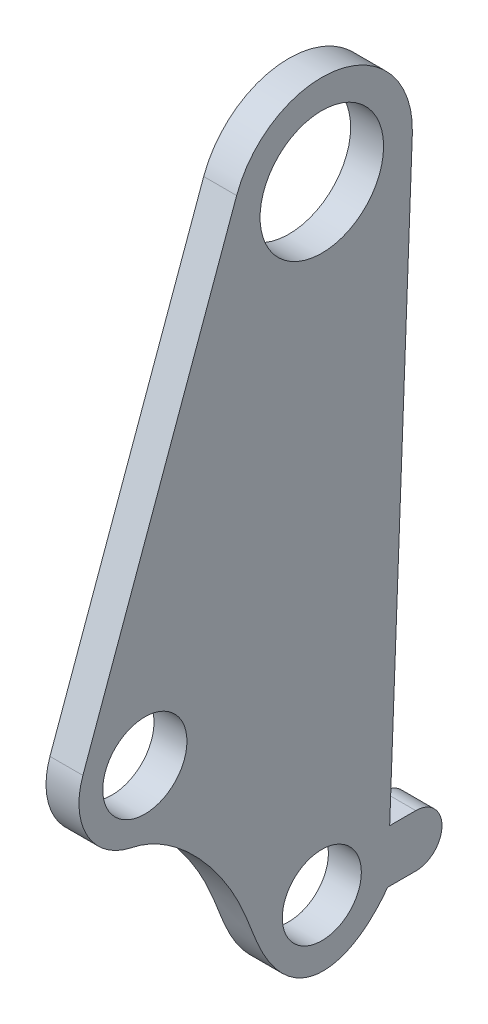
ISO-10303-21;
HEADER;
FILE_DESCRIPTION(('STEP AP214'),'2;1');
FILE_NAME('part.step','',(''),(''),'','','');
FILE_SCHEMA(('AUTOMOTIVE_DESIGN { 1 0 10303 214 1 1 1 1 }'));
ENDSEC;
DATA;
#1=APPLICATION_CONTEXT('core data for automotive mechanical design processes');
#2=APPLICATION_PROTOCOL_DEFINITION('international standard','automotive_design',2000,#1);
#3=PRODUCT_CONTEXT('',#1,'mechanical');
#4=PRODUCT('Part','Part','',(#3));
#5=PRODUCT_RELATED_PRODUCT_CATEGORY('part','',(#4));
#6=PRODUCT_DEFINITION_FORMATION('','',#4);
#7=PRODUCT_DEFINITION_CONTEXT('part definition',#1,'design');
#8=PRODUCT_DEFINITION('design','',#6,#7);
#9=PRODUCT_DEFINITION_SHAPE('','',#8);
#10=(LENGTH_UNIT() NAMED_UNIT(*) SI_UNIT(.MILLI.,.METRE.));
#11=(NAMED_UNIT(*) PLANE_ANGLE_UNIT() SI_UNIT($,.RADIAN.));
#12=(NAMED_UNIT(*) SI_UNIT($,.STERADIAN.) SOLID_ANGLE_UNIT());
#13=UNCERTAINTY_MEASURE_WITH_UNIT(LENGTH_MEASURE(1.E-05),#10,'distance_accuracy_value','');
#14=(GEOMETRIC_REPRESENTATION_CONTEXT(3) GLOBAL_UNCERTAINTY_ASSIGNED_CONTEXT((#13)) GLOBAL_UNIT_ASSIGNED_CONTEXT((#10,
#11,#12)) REPRESENTATION_CONTEXT('',''));
#15=CARTESIAN_POINT('',(0.,0.,0.));
#16=DIRECTION('',(0.,0.,1.));
#17=DIRECTION('',(1.,0.,0.));
#18=AXIS2_PLACEMENT_3D('',#15,#16,#17);
#19=CARTESIAN_POINT('',(2.54,0.,0.));
#20=DIRECTION('',(-1.,0.,0.));
#21=DIRECTION('',(0.,0.,1.));
#22=AXIS2_PLACEMENT_3D('',#19,#20,#21);
#23=PLANE('',#22);
#24=CARTESIAN_POINT('',(2.54,-32.1486320068265,13.6462846624879));
#25=DIRECTION('',(1.,0.,0.));
#26=DIRECTION('',(0.,0.,-1.));
#27=AXIS2_PLACEMENT_3D('',#24,#25,#26);
#28=CIRCLE('',#27,3.24612);
#29=CARTESIAN_POINT('',(2.54,-32.1486320068265,10.4001646624879));
#30=VERTEX_POINT('',#29);
#31=EDGE_CURVE('E314',#30,#30,#28,.T.);
#32=ORIENTED_EDGE('',*,*,#31,.F.);
#33=EDGE_LOOP('',(#32));
#34=FACE_BOUND('',#33,.T.);
#35=CARTESIAN_POINT('',(2.54,0.,0.));
#36=DIRECTION('',(1.,0.,0.));
#37=DIRECTION('',(0.,0.,1.));
#38=AXIS2_PLACEMENT_3D('',#35,#36,#37);
#39=CIRCLE('',#38,6.985);
#40=CARTESIAN_POINT('',(2.54,-0.269096125838359,-6.97981463042242));
#41=VERTEX_POINT('',#40);
#42=CARTESIAN_POINT('',(2.54,2.37448150732322,6.56902295409143));
#43=VERTEX_POINT('',#42);
#44=EDGE_CURVE('E150',#41,#43,#39,.T.);
#45=ORIENTED_EDGE('',*,*,#44,.T.);
#46=DIRECTION('',(0.,-0.940447094358114,0.339940086946775));
#47=VECTOR('',#46,1.);
#48=CARTESIAN_POINT('',(2.54,2.37448150732322,6.56902295409143));
#49=LINE('',#48,#47);
#50=CARTESIAN_POINT('',(2.54,-30.4217363651368,18.4237559018271));
#51=VERTEX_POINT('',#50);
#52=EDGE_CURVE('E93',#43,#51,#49,.T.);
#53=ORIENTED_EDGE('',*,*,#52,.T.);
#54=CARTESIAN_POINT('',(2.54,-32.1486320068265,13.6462846624879));
#55=DIRECTION('',(1.,0.,0.));
#56=DIRECTION('',(0.,0.,1.));
#57=AXIS2_PLACEMENT_3D('',#54,#55,#56);
#58=CIRCLE('',#57,5.08);
#59=CARTESIAN_POINT('',(2.54,-37.1244870220178,14.669645238138));
#60=VERTEX_POINT('',#59);
#61=EDGE_CURVE('E165',#51,#60,#58,.T.);
#62=ORIENTED_EDGE('',*,*,#61,.T.);
#63=CARTESIAN_POINT('',(2.54,-37.1244870220178,14.669645238138));
#64=CARTESIAN_POINT('',(2.54,-37.8142676215172,11.3157459996212));
#65=CARTESIAN_POINT('',(2.54,-42.7155459658299,6.92087440231046));
#66=CARTESIAN_POINT('',(2.54,-54.1753966063674,3.14946829544974));
#67=CARTESIAN_POINT('',(2.54,-53.8016461812624,-2.01655162994688));
#68=CARTESIAN_POINT('',(2.54,-49.6443,-5.0762288221254));
#69=B_SPLINE_CURVE_WITH_KNOTS('',3,(#63,#64,#65,#66,#67,#68),.UNSPECIFIED.,.F.,.F.,(4,1,1,4),
(0.,0.321172828786322,0.421172828786322,1.),.UNSPECIFIED.);
#70=CARTESIAN_POINT('',(2.54,-49.6443,-5.0762288221254));
#71=VERTEX_POINT('',#70);
#72=EDGE_CURVE('E178',#60,#71,#69,.T.);
#73=ORIENTED_EDGE('',*,*,#72,.T.);
#74=DIRECTION('',(0.,0.,-1.));
#75=VECTOR('',#74,1.);
#76=CARTESIAN_POINT('',(2.54,-49.6443,-5.07622882212539));
#77=LINE('',#76,#75);
#78=CARTESIAN_POINT('',(2.54,-49.6443,-7.24445656026835));
#79=VERTEX_POINT('',#78);
#80=EDGE_CURVE('E112',#71,#79,#77,.T.);
#81=ORIENTED_EDGE('',*,*,#80,.T.);
#82=CARTESIAN_POINT('',(2.54,-47.625,-7.24445656026835));
#83=DIRECTION('',(1.,0.,0.));
#84=DIRECTION('',(0.,0.,1.));
#85=AXIS2_PLACEMENT_3D('',#82,#83,#84);
#86=CIRCLE('',#85,2.0193);
#87=CARTESIAN_POINT('',(2.54,-45.6057,-7.24445656026835));
#88=VERTEX_POINT('',#87);
#89=EDGE_CURVE('E106',#79,#88,#86,.T.);
#90=ORIENTED_EDGE('',*,*,#89,.T.);
#91=DIRECTION('',(0.,0.,1.));
#92=VECTOR('',#91,1.);
#93=CARTESIAN_POINT('',(2.54,-45.6057,-5.23193089608506));
#94=LINE('',#93,#92);
#95=CARTESIAN_POINT('',(2.54,-45.6057,-5.23193089608506));
#96=VERTEX_POINT('',#95);
#97=EDGE_CURVE('E110',#88,#96,#94,.T.);
#98=ORIENTED_EDGE('',*,*,#97,.T.);
#99=DIRECTION('',(0.,0.999257642150668,-0.0385248569561001));
#100=VECTOR('',#99,1.);
#101=CARTESIAN_POINT('',(2.54,-0.269096125838359,-6.97981463042242));
#102=LINE('',#101,#100);
#103=EDGE_CURVE('E50',#96,#41,#102,.T.);
#104=ORIENTED_EDGE('',*,*,#103,.T.);
#105=EDGE_LOOP('',(#45,#53,#62,#73,#81,#90,#98,#104));
#106=FACE_BOUND('',#105,.T.);
#107=CARTESIAN_POINT('',(2.54,0.,0.));
#108=DIRECTION('',(1.,0.,0.));
#109=DIRECTION('',(0.,0.,-1.));
#110=AXIS2_PLACEMENT_3D('',#107,#108,#109);
#111=CIRCLE('',#110,4.7625);
#112=CARTESIAN_POINT('',(2.54,0.,-4.7625));
#113=VERTEX_POINT('',#112);
#114=EDGE_CURVE('E134',#113,#113,#111,.T.);
#115=ORIENTED_EDGE('',*,*,#114,.F.);
#116=EDGE_LOOP('',(#115));
#117=FACE_BOUND('',#116,.T.);
#118=CARTESIAN_POINT('',(2.54,-47.625,0.));
#119=DIRECTION('',(1.,0.,0.));
#120=DIRECTION('',(0.,0.,-1.));
#121=AXIS2_PLACEMENT_3D('',#118,#119,#120);
#122=CIRCLE('',#121,3.048);
#123=CARTESIAN_POINT('',(2.54,-47.625,-3.04800000000001));
#124=VERTEX_POINT('',#123);
#125=EDGE_CURVE('E305',#124,#124,#122,.T.);
#126=ORIENTED_EDGE('',*,*,#125,.F.);
#127=EDGE_LOOP('',(#126));
#128=FACE_BOUND('',#127,.T.);
#129=ADVANCED_FACE('F33',(#34,#106,#117,#128),#23,.F.);
#130=CARTESIAN_POINT('',(0.,0.,0.));
#131=DIRECTION('',(-1.,0.,0.));
#132=DIRECTION('',(0.,0.,1.));
#133=AXIS2_PLACEMENT_3D('',#130,#131,#132);
#134=PLANE('',#133);
#135=CARTESIAN_POINT('',(0.,-32.1486320068265,13.6462846624879));
#136=DIRECTION('',(1.,0.,0.));
#137=DIRECTION('',(0.,0.,-1.));
#138=AXIS2_PLACEMENT_3D('',#135,#136,#137);
#139=CIRCLE('',#138,3.24612);
#140=CARTESIAN_POINT('',(0.,-32.1486320068265,10.4001646624879));
#141=VERTEX_POINT('',#140);
#142=EDGE_CURVE('E311',#141,#141,#139,.T.);
#143=ORIENTED_EDGE('',*,*,#142,.T.);
#144=EDGE_LOOP('',(#143));
#145=FACE_BOUND('',#144,.T.);
#146=CARTESIAN_POINT('',(0.,0.,0.));
#147=DIRECTION('',(1.,0.,0.));
#148=DIRECTION('',(0.,0.,1.));
#149=AXIS2_PLACEMENT_3D('',#146,#147,#148);
#150=CIRCLE('',#149,6.985);
#151=CARTESIAN_POINT('',(0.,-0.269096125838359,-6.97981463042242));
#152=VERTEX_POINT('',#151);
#153=CARTESIAN_POINT('',(0.,2.37448150732322,6.56902295409143));
#154=VERTEX_POINT('',#153);
#155=EDGE_CURVE('E130',#152,#154,#150,.T.);
#156=ORIENTED_EDGE('',*,*,#155,.F.);
#157=DIRECTION('',(0.,0.999257642150668,-0.0385248569561001));
#158=VECTOR('',#157,1.);
#159=CARTESIAN_POINT('',(0.,-0.269096125838359,-6.97981463042242));
#160=LINE('',#159,#158);
#161=CARTESIAN_POINT('',(0.,-45.6057,-5.23193089608506));
#162=VERTEX_POINT('',#161);
#163=EDGE_CURVE('E85',#162,#152,#160,.T.);
#164=ORIENTED_EDGE('',*,*,#163,.F.);
#165=DIRECTION('',(0.,0.,1.));
#166=VECTOR('',#165,1.);
#167=CARTESIAN_POINT('',(0.,-45.6057,-5.23193089608506));
#168=LINE('',#167,#166);
#169=CARTESIAN_POINT('',(0.,-45.6057,-7.24445656026835));
#170=VERTEX_POINT('',#169);
#171=EDGE_CURVE('E79',#170,#162,#168,.T.);
#172=ORIENTED_EDGE('',*,*,#171,.F.);
#173=CARTESIAN_POINT('',(0.,-47.625,-7.24445656026835));
#174=DIRECTION('',(1.,0.,0.));
#175=DIRECTION('',(0.,0.,1.));
#176=AXIS2_PLACEMENT_3D('',#173,#174,#175);
#177=CIRCLE('',#176,2.0193);
#178=CARTESIAN_POINT('',(0.,-49.6443,-7.24445656026835));
#179=VERTEX_POINT('',#178);
#180=EDGE_CURVE('E120',#179,#170,#177,.T.);
#181=ORIENTED_EDGE('',*,*,#180,.F.);
#182=DIRECTION('',(0.,0.,-1.));
#183=VECTOR('',#182,1.);
#184=CARTESIAN_POINT('',(0.,-49.6443,-5.07622882212539));
#185=LINE('',#184,#183);
#186=CARTESIAN_POINT('',(0.,-49.6443,-5.0762288221254));
#187=VERTEX_POINT('',#186);
#188=EDGE_CURVE('E142',#187,#179,#185,.T.);
#189=ORIENTED_EDGE('',*,*,#188,.F.);
#190=CARTESIAN_POINT('',(0.,-37.1244870220178,14.669645238138));
#191=CARTESIAN_POINT('',(0.,-37.8142676215172,11.3157459996212));
#192=CARTESIAN_POINT('',(0.,-42.7155459658299,6.92087440231046));
#193=CARTESIAN_POINT('',(0.,-54.1753966063674,3.14946829544974));
#194=CARTESIAN_POINT('',(0.,-53.8016461812624,-2.01655162994688));
#195=CARTESIAN_POINT('',(0.,-49.6443,-5.0762288221254));
#196=B_SPLINE_CURVE_WITH_KNOTS('',3,(#190,#191,#192,#193,#194,#195),.UNSPECIFIED.,.F.,.F.,(4,1,
1,4),(0.,0.321172828786322,0.421172828786322,1.),.UNSPECIFIED.);
#197=CARTESIAN_POINT('',(0.,-37.1244870220178,14.669645238138));
#198=VERTEX_POINT('',#197);
#199=EDGE_CURVE('E138',#198,#187,#196,.T.);
#200=ORIENTED_EDGE('',*,*,#199,.F.);
#201=CARTESIAN_POINT('',(0.,-32.1486320068265,13.6462846624879));
#202=DIRECTION('',(1.,0.,0.));
#203=DIRECTION('',(0.,0.,1.));
#204=AXIS2_PLACEMENT_3D('',#201,#202,#203);
#205=CIRCLE('',#204,5.08);
#206=CARTESIAN_POINT('',(0.,-30.4217363651368,18.4237559018271));
#207=VERTEX_POINT('',#206);
#208=EDGE_CURVE('E136',#207,#198,#205,.T.);
#209=ORIENTED_EDGE('',*,*,#208,.F.);
#210=DIRECTION('',(0.,-0.940447094358114,0.339940086946775));
#211=VECTOR('',#210,1.);
#212=CARTESIAN_POINT('',(0.,2.37448150732322,6.56902295409143));
#213=LINE('',#212,#211);
#214=EDGE_CURVE('E133',#154,#207,#213,.T.);
#215=ORIENTED_EDGE('',*,*,#214,.F.);
#216=EDGE_LOOP('',(#156,#164,#172,#181,#189,#200,#209,#215));
#217=FACE_BOUND('',#216,.T.);
#218=CARTESIAN_POINT('',(0.,0.,0.));
#219=DIRECTION('',(1.,0.,0.));
#220=DIRECTION('',(0.,0.,-1.));
#221=AXIS2_PLACEMENT_3D('',#218,#219,#220);
#222=CIRCLE('',#221,4.7625);
#223=CARTESIAN_POINT('',(0.,0.,-4.7625));
#224=VERTEX_POINT('',#223);
#225=EDGE_CURVE('E317',#224,#224,#222,.T.);
#226=ORIENTED_EDGE('',*,*,#225,.T.);
#227=EDGE_LOOP('',(#226));
#228=FACE_BOUND('',#227,.T.);
#229=CARTESIAN_POINT('',(0.,-47.625,0.));
#230=DIRECTION('',(1.,0.,0.));
#231=DIRECTION('',(0.,0.,-1.));
#232=AXIS2_PLACEMENT_3D('',#229,#230,#231);
#233=CIRCLE('',#232,3.048);
#234=CARTESIAN_POINT('',(0.,-47.625,-3.04800000000001));
#235=VERTEX_POINT('',#234);
#236=EDGE_CURVE('E308',#235,#235,#233,.T.);
#237=ORIENTED_EDGE('',*,*,#236,.T.);
#238=EDGE_LOOP('',(#237));
#239=FACE_BOUND('',#238,.T.);
#240=ADVANCED_FACE('F169',(#145,#217,#228,#239),#134,.T.);
#241=CARTESIAN_POINT('',(2.54,0.,0.));
#242=DIRECTION('',(-1.,0.,0.));
#243=DIRECTION('',(0.,0.,1.));
#244=AXIS2_PLACEMENT_3D('',#241,#242,#243);
#245=CYLINDRICAL_SURFACE('',#244,6.985);
#246=ORIENTED_EDGE('',*,*,#155,.T.);
#247=DIRECTION('',(-1.,0.,0.));
#248=VECTOR('',#247,1.);
#249=CARTESIAN_POINT('',(2.54,2.37448150732322,6.56902295409143));
#250=LINE('',#249,#248);
#251=EDGE_CURVE('E11',#43,#154,#250,.T.);
#252=ORIENTED_EDGE('',*,*,#251,.F.);
#253=ORIENTED_EDGE('',*,*,#44,.F.);
#254=DIRECTION('',(-1.,0.,0.));
#255=VECTOR('',#254,1.);
#256=CARTESIAN_POINT('',(2.54,-0.269096125838359,-6.97981463042242));
#257=LINE('',#256,#255);
#258=EDGE_CURVE('E126',#41,#152,#257,.T.);
#259=ORIENTED_EDGE('',*,*,#258,.T.);
#260=EDGE_LOOP('',(#246,#252,#253,#259));
#261=FACE_BOUND('',#260,.T.);
#262=ADVANCED_FACE('F35',(#261),#245,.T.);
#263=CARTESIAN_POINT('',(2.54,2.37448150732322,6.56902295409143));
#264=DIRECTION('',(0.,-0.339940086946775,-0.940447094358114));
#265=DIRECTION('',(0.,0.940447094358114,-0.339940086946775));
#266=AXIS2_PLACEMENT_3D('',#263,#264,#265);
#267=PLANE('',#266);
#268=ORIENTED_EDGE('',*,*,#214,.T.);
#269=DIRECTION('',(-1.,0.,0.));
#270=VECTOR('',#269,1.);
#271=CARTESIAN_POINT('',(2.54,-30.4217363651368,18.4237559018271));
#272=LINE('',#271,#270);
#273=EDGE_CURVE('E42',#51,#207,#272,.T.);
#274=ORIENTED_EDGE('',*,*,#273,.F.);
#275=ORIENTED_EDGE('',*,*,#52,.F.);
#276=ORIENTED_EDGE('',*,*,#251,.T.);
#277=EDGE_LOOP('',(#268,#274,#275,#276));
#278=FACE_BOUND('',#277,.T.);
#279=ADVANCED_FACE('F194',(#278),#267,.F.);
#280=CARTESIAN_POINT('',(2.54,-32.1486320068265,13.6462846624879));
#281=DIRECTION('',(-1.,0.,0.));
#282=DIRECTION('',(0.,0.,1.));
#283=AXIS2_PLACEMENT_3D('',#280,#281,#282);
#284=CYLINDRICAL_SURFACE('',#283,5.08);
#285=ORIENTED_EDGE('',*,*,#208,.T.);
#286=DIRECTION('',(-1.,0.,0.));
#287=VECTOR('',#286,1.);
#288=CARTESIAN_POINT('',(2.54,-37.1244870220178,14.669645238138));
#289=LINE('',#288,#287);
#290=EDGE_CURVE('E157',#60,#198,#289,.T.);
#291=ORIENTED_EDGE('',*,*,#290,.F.);
#292=ORIENTED_EDGE('',*,*,#61,.F.);
#293=ORIENTED_EDGE('',*,*,#273,.T.);
#294=EDGE_LOOP('',(#285,#291,#292,#293));
#295=FACE_BOUND('',#294,.T.);
#296=ADVANCED_FACE('F163',(#295),#284,.T.);
#297=DIRECTION('',(-1.,0.,0.));
#298=VECTOR('',#297,1.);
#299=SURFACE_OF_LINEAR_EXTRUSION('',#69,#298);
#300=ORIENTED_EDGE('',*,*,#199,.T.);
#301=DIRECTION('',(-1.,0.,0.));
#302=VECTOR('',#301,1.);
#303=CARTESIAN_POINT('',(2.54,-49.6443,-5.0762288221254));
#304=LINE('',#303,#302);
#305=EDGE_CURVE('E154',#71,#187,#304,.T.);
#306=ORIENTED_EDGE('',*,*,#305,.F.);
#307=ORIENTED_EDGE('',*,*,#72,.F.);
#308=ORIENTED_EDGE('',*,*,#290,.T.);
#309=EDGE_LOOP('',(#300,#306,#307,#308));
#310=FACE_BOUND('',#309,.T.);
#311=ADVANCED_FACE('F174',(#310),#299,.F.);
#312=CARTESIAN_POINT('',(2.54,-49.6443,-5.07622882212539));
#313=DIRECTION('',(0.,1.,0.));
#314=DIRECTION('',(0.,0.,1.));
#315=AXIS2_PLACEMENT_3D('',#312,#313,#314);
#316=PLANE('',#315);
#317=ORIENTED_EDGE('',*,*,#188,.T.);
#318=DIRECTION('',(-1.,0.,0.));
#319=VECTOR('',#318,1.);
#320=CARTESIAN_POINT('',(2.54,-49.6443,-7.24445656026835));
#321=LINE('',#320,#319);
#322=EDGE_CURVE('E121',#79,#179,#321,.T.);
#323=ORIENTED_EDGE('',*,*,#322,.F.);
#324=ORIENTED_EDGE('',*,*,#80,.F.);
#325=ORIENTED_EDGE('',*,*,#305,.T.);
#326=EDGE_LOOP('',(#317,#323,#324,#325));
#327=FACE_BOUND('',#326,.T.);
#328=ADVANCED_FACE('F177',(#327),#316,.F.);
#329=CARTESIAN_POINT('',(2.54,-47.625,-7.24445656026835));
#330=DIRECTION('',(-1.,0.,0.));
#331=DIRECTION('',(0.,0.,1.));
#332=AXIS2_PLACEMENT_3D('',#329,#330,#331);
#333=CYLINDRICAL_SURFACE('',#332,2.0193);
#334=ORIENTED_EDGE('',*,*,#180,.T.);
#335=DIRECTION('',(-1.,0.,0.));
#336=VECTOR('',#335,1.);
#337=CARTESIAN_POINT('',(2.54,-45.6057,-7.24445656026835));
#338=LINE('',#337,#336);
#339=EDGE_CURVE('E117',#88,#170,#338,.T.);
#340=ORIENTED_EDGE('',*,*,#339,.F.);
#341=ORIENTED_EDGE('',*,*,#89,.F.);
#342=ORIENTED_EDGE('',*,*,#322,.T.);
#343=EDGE_LOOP('',(#334,#340,#341,#342));
#344=FACE_BOUND('',#343,.T.);
#345=ADVANCED_FACE('F118',(#344),#333,.T.);
#346=CARTESIAN_POINT('',(2.54,-45.6057,-5.23193089608506));
#347=DIRECTION('',(0.,-1.,0.));
#348=DIRECTION('',(0.,0.,-1.));
#349=AXIS2_PLACEMENT_3D('',#346,#347,#348);
#350=PLANE('',#349);
#351=ORIENTED_EDGE('',*,*,#171,.T.);
#352=DIRECTION('',(-1.,0.,0.));
#353=VECTOR('',#352,1.);
#354=CARTESIAN_POINT('',(2.54,-45.6057,-5.23193089608506));
#355=LINE('',#354,#353);
#356=EDGE_CURVE('E122',#96,#162,#355,.T.);
#357=ORIENTED_EDGE('',*,*,#356,.F.);
#358=ORIENTED_EDGE('',*,*,#97,.F.);
#359=ORIENTED_EDGE('',*,*,#339,.T.);
#360=EDGE_LOOP('',(#351,#357,#358,#359));
#361=FACE_BOUND('',#360,.T.);
#362=ADVANCED_FACE('F124',(#361),#350,.F.);
#363=CARTESIAN_POINT('',(2.54,-0.269096125838359,-6.97981463042242));
#364=DIRECTION('',(0.,0.0385248569561001,0.999257642150668));
#365=DIRECTION('',(0.,-0.999257642150668,0.0385248569561001));
#366=AXIS2_PLACEMENT_3D('',#363,#364,#365);
#367=PLANE('',#366);
#368=ORIENTED_EDGE('',*,*,#163,.T.);
#369=ORIENTED_EDGE('',*,*,#258,.F.);
#370=ORIENTED_EDGE('',*,*,#103,.F.);
#371=ORIENTED_EDGE('',*,*,#356,.T.);
#372=EDGE_LOOP('',(#368,#369,#370,#371));
#373=FACE_BOUND('',#372,.T.);
#374=ADVANCED_FACE('F213',(#373),#367,.F.);
#375=CARTESIAN_POINT('',(2.54,0.,0.));
#376=DIRECTION('',(-1.,0.,0.));
#377=DIRECTION('',(0.,0.,1.));
#378=AXIS2_PLACEMENT_3D('',#375,#376,#377);
#379=CYLINDRICAL_SURFACE('',#378,4.7625);
#380=ORIENTED_EDGE('',*,*,#114,.T.);
#381=EDGE_LOOP('',(#380));
#382=FACE_BOUND('',#381,.T.);
#383=ORIENTED_EDGE('',*,*,#225,.F.);
#384=EDGE_LOOP('',(#383));
#385=FACE_BOUND('',#384,.T.);
#386=ADVANCED_FACE('F210',(#382,#385),#379,.F.);
#387=CARTESIAN_POINT('',(2.54,-32.1486320068265,13.6462846624879));
#388=DIRECTION('',(-1.,0.,0.));
#389=DIRECTION('',(0.,0.,1.));
#390=AXIS2_PLACEMENT_3D('',#387,#388,#389);
#391=CYLINDRICAL_SURFACE('',#390,3.24612);
#392=ORIENTED_EDGE('',*,*,#31,.T.);
#393=EDGE_LOOP('',(#392));
#394=FACE_BOUND('',#393,.T.);
#395=ORIENTED_EDGE('',*,*,#142,.F.);
#396=EDGE_LOOP('',(#395));
#397=FACE_BOUND('',#396,.T.);
#398=ADVANCED_FACE('F279',(#394,#397),#391,.F.);
#399=CARTESIAN_POINT('',(2.54,-47.625,0.));
#400=DIRECTION('',(-1.,0.,0.));
#401=DIRECTION('',(0.,0.,1.));
#402=AXIS2_PLACEMENT_3D('',#399,#400,#401);
#403=CYLINDRICAL_SURFACE('',#402,3.048);
#404=ORIENTED_EDGE('',*,*,#125,.T.);
#405=EDGE_LOOP('',(#404));
#406=FACE_BOUND('',#405,.T.);
#407=ORIENTED_EDGE('',*,*,#236,.F.);
#408=EDGE_LOOP('',(#407));
#409=FACE_BOUND('',#408,.T.);
#410=ADVANCED_FACE('F287',(#406,#409),#403,.F.);
#411=CLOSED_SHELL('',(#129,#240,#262,#279,#296,#311,#328,#345,#362,#374,#386,#398,#410));
#412=MANIFOLD_SOLID_BREP('B2',#411);
#413=ADVANCED_BREP_SHAPE_REPRESENTATION('',(#18,#412),#14);
#414=SHAPE_DEFINITION_REPRESENTATION(#9,#413);
ENDSEC;
END-ISO-10303-21;
